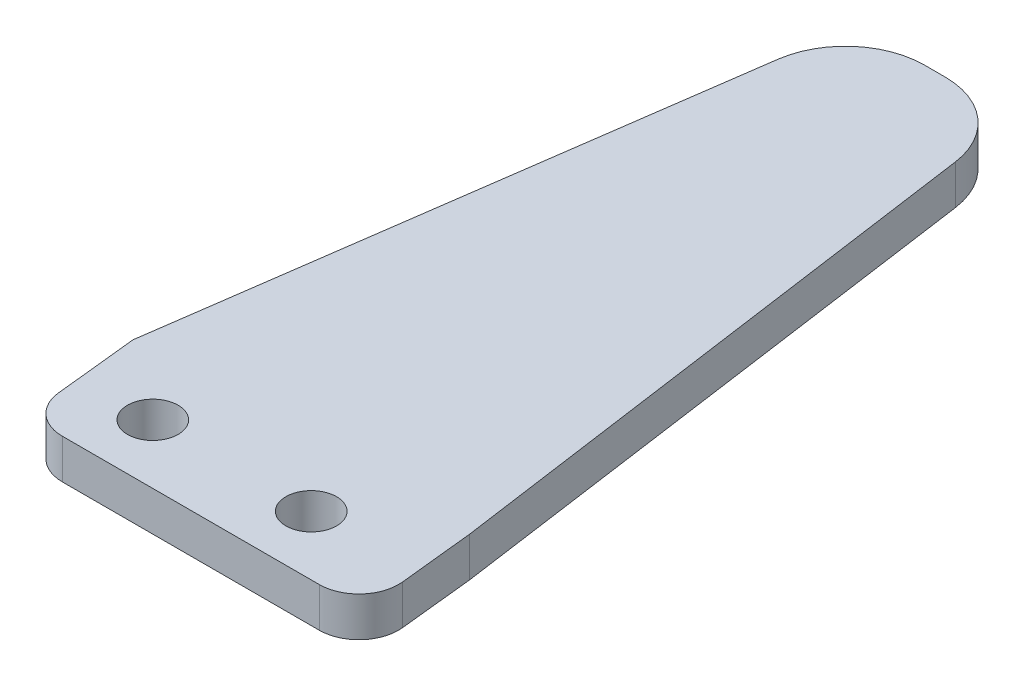
ISO-10303-21;
HEADER;
FILE_DESCRIPTION(('STEP AP214'),'2;1');
FILE_NAME('part.step','',(''),(''),'','','');
FILE_SCHEMA(('AUTOMOTIVE_DESIGN { 1 0 10303 214 1 1 1 1 }'));
ENDSEC;
DATA;
#1=APPLICATION_CONTEXT('core data for automotive mechanical design processes');
#2=APPLICATION_PROTOCOL_DEFINITION('international standard','automotive_design',2000,#1);
#3=PRODUCT_CONTEXT('',#1,'mechanical');
#4=PRODUCT('Part','Part','',(#3));
#5=PRODUCT_RELATED_PRODUCT_CATEGORY('part','',(#4));
#6=PRODUCT_DEFINITION_FORMATION('','',#4);
#7=PRODUCT_DEFINITION_CONTEXT('part definition',#1,'design');
#8=PRODUCT_DEFINITION('design','',#6,#7);
#9=PRODUCT_DEFINITION_SHAPE('','',#8);
#10=(LENGTH_UNIT() NAMED_UNIT(*) SI_UNIT(.MILLI.,.METRE.));
#11=(NAMED_UNIT(*) PLANE_ANGLE_UNIT() SI_UNIT($,.RADIAN.));
#12=(NAMED_UNIT(*) SI_UNIT($,.STERADIAN.) SOLID_ANGLE_UNIT());
#13=UNCERTAINTY_MEASURE_WITH_UNIT(LENGTH_MEASURE(1.E-05),#10,'distance_accuracy_value','');
#14=(GEOMETRIC_REPRESENTATION_CONTEXT(3) GLOBAL_UNCERTAINTY_ASSIGNED_CONTEXT((#13)) GLOBAL_UNIT_ASSIGNED_CONTEXT((#10,
#11,#12)) REPRESENTATION_CONTEXT('',''));
#15=CARTESIAN_POINT('',(0.,0.,0.));
#16=DIRECTION('',(0.,0.,1.));
#17=DIRECTION('',(1.,0.,0.));
#18=AXIS2_PLACEMENT_3D('',#15,#16,#17);
#19=CARTESIAN_POINT('',(0.,3.175,0.));
#20=DIRECTION('',(0.,1.,0.));
#21=DIRECTION('',(0.,0.,1.));
#22=AXIS2_PLACEMENT_3D('',#19,#20,#21);
#23=PLANE('',#22);
#24=CARTESIAN_POINT('',(50.8,3.175,-4.7625));
#25=DIRECTION('',(0.,1.,0.));
#26=DIRECTION('',(0.,0.,1.));
#27=AXIS2_PLACEMENT_3D('',#24,#25,#26);
#28=CIRCLE('',#27,2.03200000000001);
#29=CARTESIAN_POINT('',(50.8,3.175,-2.73049999999999));
#30=VERTEX_POINT('',#29);
#31=EDGE_CURVE('E269',#30,#30,#28,.T.);
#32=ORIENTED_EDGE('',*,*,#31,.F.);
#33=EDGE_LOOP('',(#32));
#34=FACE_BOUND('',#33,.T.);
#35=DIRECTION('',(1.,0.,0.));
#36=VECTOR('',#35,1.);
#37=CARTESIAN_POINT('',(45.4511178409056,3.175,0.));
#38=LINE('',#37,#36);
#39=CARTESIAN_POINT('',(48.3099006815512,3.175,0.));
#40=VERTEX_POINT('',#39);
#41=CARTESIAN_POINT('',(68.9124231063229,3.175,0.));
#42=VERTEX_POINT('',#41);
#43=EDGE_CURVE('E162',#40,#42,#38,.T.);
#44=ORIENTED_EDGE('',*,*,#43,.T.);
#45=CARTESIAN_POINT('',(68.9124231063229,3.175,-3.175));
#46=DIRECTION('',(0.,1.,0.));
#47=DIRECTION('',(0.,0.,1.));
#48=AXIS2_PLACEMENT_3D('',#45,#46,#47);
#49=CIRCLE('',#48,3.175);
#50=CARTESIAN_POINT('',(72.0700301241172,3.175,-3.50687787087481));
#51=VERTEX_POINT('',#50);
#52=EDGE_CURVE('E54',#42,#51,#49,.T.);
#53=ORIENTED_EDGE('',*,*,#52,.T.);
#54=DIRECTION('',(-0.104528463267657,0.,-0.994521895368273));
#55=VECTOR('',#54,1.);
#56=CARTESIAN_POINT('',(72.4386178409056,3.175,0.));
#57=LINE('',#56,#55);
#58=CARTESIAN_POINT('',(71.4375,3.175,-9.525));
#59=VERTEX_POINT('',#58);
#60=EDGE_CURVE('E226',#51,#59,#57,.T.);
#61=ORIENTED_EDGE('',*,*,#60,.T.);
#62=DIRECTION('',(-0.139254831399099,0.,-0.990256578838034));
#63=VECTOR('',#62,1.);
#64=CARTESIAN_POINT('',(71.4375,3.175,-9.525));
#65=LINE('',#64,#63);
#66=CARTESIAN_POINT('',(65.0623685372741,3.175,-54.8592681793843));
#67=VERTEX_POINT('',#66);
#68=EDGE_CURVE('E234',#59,#67,#65,.T.);
#69=ORIENTED_EDGE('',*,*,#68,.T.);
#70=CARTESIAN_POINT('',(58.7742392616526,3.175,-53.975));
#71=DIRECTION('',(0.,1.,0.));
#72=DIRECTION('',(0.,0.,1.));
#73=AXIS2_PLACEMENT_3D('',#70,#71,#72);
#74=CIRCLE('',#73,6.35);
#75=CARTESIAN_POINT('',(58.7742392616526,3.175,-60.325));
#76=VERTEX_POINT('',#75);
#77=EDGE_CURVE('E194',#67,#76,#74,.T.);
#78=ORIENTED_EDGE('',*,*,#77,.T.);
#79=DIRECTION('',(-1.,0.,0.));
#80=VECTOR('',#79,1.);
#81=CARTESIAN_POINT('',(64.29375,3.175,-60.325));
#82=LINE('',#81,#80);
#83=CARTESIAN_POINT('',(57.1132607383474,3.175,-60.325));
#84=VERTEX_POINT('',#83);
#85=EDGE_CURVE('E178',#76,#84,#82,.T.);
#86=ORIENTED_EDGE('',*,*,#85,.T.);
#87=CARTESIAN_POINT('',(57.1132607383474,3.175,-53.975));
#88=DIRECTION('',(0.,1.,0.));
#89=DIRECTION('',(0.,0.,1.));
#90=AXIS2_PLACEMENT_3D('',#87,#88,#89);
#91=CIRCLE('',#90,6.35);
#92=CARTESIAN_POINT('',(50.8251314627259,3.175,-54.8592681793843));
#93=VERTEX_POINT('',#92);
#94=EDGE_CURVE('E150',#84,#93,#91,.T.);
#95=ORIENTED_EDGE('',*,*,#94,.T.);
#96=DIRECTION('',(-0.139254831399099,0.,0.990256578838035));
#97=VECTOR('',#96,1.);
#98=CARTESIAN_POINT('',(44.45,3.175,-9.525));
#99=LINE('',#98,#97);
#100=CARTESIAN_POINT('',(44.45,3.175,-9.525));
#101=VERTEX_POINT('',#100);
#102=EDGE_CURVE('E144',#93,#101,#99,.T.);
#103=ORIENTED_EDGE('',*,*,#102,.T.);
#104=DIRECTION('',(0.104528463267659,0.,0.994521895368273));
#105=VECTOR('',#104,1.);
#106=CARTESIAN_POINT('',(44.45,3.175,-9.525));
#107=LINE('',#106,#105);
#108=CARTESIAN_POINT('',(45.152293663757,3.175,-2.84312212912518));
#109=VERTEX_POINT('',#108);
#110=EDGE_CURVE('E146',#101,#109,#107,.T.);
#111=ORIENTED_EDGE('',*,*,#110,.T.);
#112=CARTESIAN_POINT('',(48.3099006815512,3.175,-3.175));
#113=DIRECTION('',(0.,1.,0.));
#114=DIRECTION('',(0.,0.,1.));
#115=AXIS2_PLACEMENT_3D('',#112,#113,#114);
#116=CIRCLE('',#115,3.175);
#117=EDGE_CURVE('E218',#109,#40,#116,.T.);
#118=ORIENTED_EDGE('',*,*,#117,.T.);
#119=EDGE_LOOP('',(#44,#53,#61,#69,#78,#86,#95,#103,#111,#118));
#120=FACE_BOUND('',#119,.T.);
#121=CARTESIAN_POINT('',(63.5,3.175,-4.7625));
#122=DIRECTION('',(0.,1.,0.));
#123=DIRECTION('',(0.,0.,1.));
#124=AXIS2_PLACEMENT_3D('',#121,#122,#123);
#125=CIRCLE('',#124,2.03200000000001);
#126=CARTESIAN_POINT('',(63.5,3.175,-2.73049999999999));
#127=VERTEX_POINT('',#126);
#128=EDGE_CURVE('E283',#127,#127,#125,.T.);
#129=ORIENTED_EDGE('',*,*,#128,.F.);
#130=EDGE_LOOP('',(#129));
#131=FACE_BOUND('',#130,.T.);
#132=ADVANCED_FACE('F45',(#34,#120,#131),#23,.T.);
#133=CARTESIAN_POINT('',(0.,0.,0.));
#134=DIRECTION('',(0.,1.,0.));
#135=DIRECTION('',(0.,0.,1.));
#136=AXIS2_PLACEMENT_3D('',#133,#134,#135);
#137=PLANE('',#136);
#138=DIRECTION('',(-0.104528463267657,0.,-0.994521895368273));
#139=VECTOR('',#138,1.);
#140=CARTESIAN_POINT('',(72.4386178409056,0.,0.));
#141=LINE('',#140,#139);
#142=CARTESIAN_POINT('',(72.0700301241172,0.,-3.50687787087481));
#143=VERTEX_POINT('',#142);
#144=CARTESIAN_POINT('',(71.4375,0.,-9.525));
#145=VERTEX_POINT('',#144);
#146=EDGE_CURVE('E243',#143,#145,#141,.T.);
#147=ORIENTED_EDGE('',*,*,#146,.F.);
#148=CARTESIAN_POINT('',(68.9124231063229,0.,-3.175));
#149=DIRECTION('',(0.,1.,0.));
#150=DIRECTION('',(0.,0.,1.));
#151=AXIS2_PLACEMENT_3D('',#148,#149,#150);
#152=CIRCLE('',#151,3.175);
#153=CARTESIAN_POINT('',(68.9124231063229,0.,0.));
#154=VERTEX_POINT('',#153);
#155=EDGE_CURVE('E209',#143,#154,#152,.F.);
#156=ORIENTED_EDGE('',*,*,#155,.T.);
#157=DIRECTION('',(1.,0.,0.));
#158=VECTOR('',#157,1.);
#159=CARTESIAN_POINT('',(45.4511178409056,0.,0.));
#160=LINE('',#159,#158);
#161=CARTESIAN_POINT('',(48.3099006815512,0.,0.));
#162=VERTEX_POINT('',#161);
#163=EDGE_CURVE('E241',#162,#154,#160,.T.);
#164=ORIENTED_EDGE('',*,*,#163,.F.);
#165=CARTESIAN_POINT('',(48.3099006815512,0.,-3.175));
#166=DIRECTION('',(0.,1.,0.));
#167=DIRECTION('',(0.,0.,1.));
#168=AXIS2_PLACEMENT_3D('',#165,#166,#167);
#169=CIRCLE('',#168,3.175);
#170=CARTESIAN_POINT('',(45.152293663757,0.,-2.84312212912518));
#171=VERTEX_POINT('',#170);
#172=EDGE_CURVE('E206',#162,#171,#169,.F.);
#173=ORIENTED_EDGE('',*,*,#172,.T.);
#174=DIRECTION('',(0.104528463267659,0.,0.994521895368273));
#175=VECTOR('',#174,1.);
#176=CARTESIAN_POINT('',(44.45,0.,-9.525));
#177=LINE('',#176,#175);
#178=CARTESIAN_POINT('',(44.45,0.,-9.525));
#179=VERTEX_POINT('',#178);
#180=EDGE_CURVE('E246',#179,#171,#177,.T.);
#181=ORIENTED_EDGE('',*,*,#180,.F.);
#182=DIRECTION('',(-0.139254831399099,0.,0.990256578838035));
#183=VECTOR('',#182,1.);
#184=CARTESIAN_POINT('',(44.45,0.,-9.525));
#185=LINE('',#184,#183);
#186=CARTESIAN_POINT('',(50.8251314627259,0.,-54.8592681793843));
#187=VERTEX_POINT('',#186);
#188=EDGE_CURVE('E166',#187,#179,#185,.T.);
#189=ORIENTED_EDGE('',*,*,#188,.F.);
#190=CARTESIAN_POINT('',(57.1132607383474,0.,-53.975));
#191=DIRECTION('',(0.,1.,0.));
#192=DIRECTION('',(0.,0.,1.));
#193=AXIS2_PLACEMENT_3D('',#190,#191,#192);
#194=CIRCLE('',#193,6.35);
#195=CARTESIAN_POINT('',(57.1132607383474,0.,-60.325));
#196=VERTEX_POINT('',#195);
#197=EDGE_CURVE('E184',#187,#196,#194,.F.);
#198=ORIENTED_EDGE('',*,*,#197,.T.);
#199=DIRECTION('',(-1.,0.,0.));
#200=VECTOR('',#199,1.);
#201=CARTESIAN_POINT('',(64.29375,0.,-60.325));
#202=LINE('',#201,#200);
#203=CARTESIAN_POINT('',(58.7742392616526,0.,-60.325));
#204=VERTEX_POINT('',#203);
#205=EDGE_CURVE('E156',#204,#196,#202,.T.);
#206=ORIENTED_EDGE('',*,*,#205,.F.);
#207=CARTESIAN_POINT('',(58.7742392616526,0.,-53.975));
#208=DIRECTION('',(0.,1.,0.));
#209=DIRECTION('',(0.,0.,1.));
#210=AXIS2_PLACEMENT_3D('',#207,#208,#209);
#211=CIRCLE('',#210,6.35);
#212=CARTESIAN_POINT('',(65.0623685372741,0.,-54.8592681793843));
#213=VERTEX_POINT('',#212);
#214=EDGE_CURVE('E174',#204,#213,#211,.F.);
#215=ORIENTED_EDGE('',*,*,#214,.T.);
#216=DIRECTION('',(-0.139254831399099,0.,-0.990256578838034));
#217=VECTOR('',#216,1.);
#218=CARTESIAN_POINT('',(71.4375,0.,-9.525));
#219=LINE('',#218,#217);
#220=EDGE_CURVE('E250',#145,#213,#219,.T.);
#221=ORIENTED_EDGE('',*,*,#220,.F.);
#222=EDGE_LOOP('',(#147,#156,#164,#173,#181,#189,#198,#206,#215,#221));
#223=FACE_BOUND('',#222,.T.);
#224=CARTESIAN_POINT('',(50.8,0.,-4.7625));
#225=DIRECTION('',(0.,1.,0.));
#226=DIRECTION('',(0.,0.,1.));
#227=AXIS2_PLACEMENT_3D('',#224,#225,#226);
#228=CIRCLE('',#227,2.03200000000001);
#229=CARTESIAN_POINT('',(50.8,0.,-2.73049999999999));
#230=VERTEX_POINT('',#229);
#231=EDGE_CURVE('E272',#230,#230,#228,.T.);
#232=ORIENTED_EDGE('',*,*,#231,.T.);
#233=EDGE_LOOP('',(#232));
#234=FACE_BOUND('',#233,.T.);
#235=CARTESIAN_POINT('',(63.5,0.,-4.7625));
#236=DIRECTION('',(0.,1.,0.));
#237=DIRECTION('',(0.,0.,1.));
#238=AXIS2_PLACEMENT_3D('',#235,#236,#237);
#239=CIRCLE('',#238,2.03200000000001);
#240=CARTESIAN_POINT('',(63.5,0.,-2.73049999999999));
#241=VERTEX_POINT('',#240);
#242=EDGE_CURVE('E285',#241,#241,#239,.T.);
#243=ORIENTED_EDGE('',*,*,#242,.T.);
#244=EDGE_LOOP('',(#243));
#245=FACE_BOUND('',#244,.T.);
#246=ADVANCED_FACE('F239',(#223,#234,#245),#137,.F.);
#247=CARTESIAN_POINT('',(44.45,3.175,-9.525));
#248=DIRECTION('',(0.990256578838035,0.,0.139254831399099));
#249=DIRECTION('',(0.139254831399099,0.,-0.990256578838035));
#250=AXIS2_PLACEMENT_3D('',#247,#248,#249);
#251=PLANE('',#250);
#252=ORIENTED_EDGE('',*,*,#102,.F.);
#253=DIRECTION('',(0.,-1.,0.));
#254=VECTOR('',#253,1.);
#255=CARTESIAN_POINT('',(50.8251314627259,3.175,-54.8592681793843));
#256=LINE('',#255,#254);
#257=EDGE_CURVE('E169',#93,#187,#256,.T.);
#258=ORIENTED_EDGE('',*,*,#257,.T.);
#259=ORIENTED_EDGE('',*,*,#188,.T.);
#260=DIRECTION('',(0.,-1.,0.));
#261=VECTOR('',#260,1.);
#262=CARTESIAN_POINT('',(44.45,3.175,-9.525));
#263=LINE('',#262,#261);
#264=EDGE_CURVE('E160',#101,#179,#263,.T.);
#265=ORIENTED_EDGE('',*,*,#264,.F.);
#266=EDGE_LOOP('',(#252,#258,#259,#265));
#267=FACE_BOUND('',#266,.T.);
#268=ADVANCED_FACE('F164',(#267),#251,.F.);
#269=CARTESIAN_POINT('',(44.45,3.175,-9.525));
#270=DIRECTION('',(0.994521895368273,0.,-0.104528463267659));
#271=DIRECTION('',(-0.104528463267659,0.,-0.994521895368273));
#272=AXIS2_PLACEMENT_3D('',#269,#270,#271);
#273=PLANE('',#272);
#274=ORIENTED_EDGE('',*,*,#180,.T.);
#275=DIRECTION('',(0.,-1.,0.));
#276=VECTOR('',#275,1.);
#277=CARTESIAN_POINT('',(45.152293663757,3.175,-2.84312212912518));
#278=LINE('',#277,#276);
#279=EDGE_CURVE('E11',#171,#109,#278,.F.);
#280=ORIENTED_EDGE('',*,*,#279,.T.);
#281=ORIENTED_EDGE('',*,*,#110,.F.);
#282=ORIENTED_EDGE('',*,*,#264,.T.);
#283=EDGE_LOOP('',(#274,#280,#281,#282));
#284=FACE_BOUND('',#283,.T.);
#285=ADVANCED_FACE('F159',(#284),#273,.F.);
#286=CARTESIAN_POINT('',(45.4511178409056,3.175,0.));
#287=DIRECTION('',(0.,0.,-1.));
#288=DIRECTION('',(-1.,0.,0.));
#289=AXIS2_PLACEMENT_3D('',#286,#287,#288);
#290=PLANE('',#289);
#291=ORIENTED_EDGE('',*,*,#163,.T.);
#292=DIRECTION('',(0.,-1.,0.));
#293=VECTOR('',#292,1.);
#294=CARTESIAN_POINT('',(68.9124231063229,3.175,0.));
#295=LINE('',#294,#293);
#296=EDGE_CURVE('E72',#154,#42,#295,.F.);
#297=ORIENTED_EDGE('',*,*,#296,.T.);
#298=ORIENTED_EDGE('',*,*,#43,.F.);
#299=DIRECTION('',(0.,-1.,0.));
#300=VECTOR('',#299,1.);
#301=CARTESIAN_POINT('',(48.3099006815512,3.175,0.));
#302=LINE('',#301,#300);
#303=EDGE_CURVE('E212',#40,#162,#302,.T.);
#304=ORIENTED_EDGE('',*,*,#303,.T.);
#305=EDGE_LOOP('',(#291,#297,#298,#304));
#306=FACE_BOUND('',#305,.T.);
#307=ADVANCED_FACE('F244',(#306),#290,.F.);
#308=CARTESIAN_POINT('',(72.4386178409056,3.175,0.));
#309=DIRECTION('',(-0.994521895368273,0.,0.104528463267657));
#310=DIRECTION('',(0.104528463267657,0.,0.994521895368273));
#311=AXIS2_PLACEMENT_3D('',#308,#309,#310);
#312=PLANE('',#311);
#313=ORIENTED_EDGE('',*,*,#60,.F.);
#314=DIRECTION('',(0.,-1.,0.));
#315=VECTOR('',#314,1.);
#316=CARTESIAN_POINT('',(72.0700301241172,3.175,-3.50687787087481));
#317=LINE('',#316,#315);
#318=EDGE_CURVE('E202',#51,#143,#317,.T.);
#319=ORIENTED_EDGE('',*,*,#318,.T.);
#320=ORIENTED_EDGE('',*,*,#146,.T.);
#321=DIRECTION('',(0.,-1.,0.));
#322=VECTOR('',#321,1.);
#323=CARTESIAN_POINT('',(71.4375,3.175,-9.525));
#324=LINE('',#323,#322);
#325=EDGE_CURVE('E170',#59,#145,#324,.T.);
#326=ORIENTED_EDGE('',*,*,#325,.F.);
#327=EDGE_LOOP('',(#313,#319,#320,#326));
#328=FACE_BOUND('',#327,.T.);
#329=ADVANCED_FACE('F231',(#328),#312,.F.);
#330=CARTESIAN_POINT('',(71.4375,3.175,-9.525));
#331=DIRECTION('',(-0.990256578838034,0.,0.139254831399099));
#332=DIRECTION('',(0.139254831399099,0.,0.990256578838035));
#333=AXIS2_PLACEMENT_3D('',#330,#331,#332);
#334=PLANE('',#333);
#335=ORIENTED_EDGE('',*,*,#220,.T.);
#336=DIRECTION('',(0.,-1.,0.));
#337=VECTOR('',#336,1.);
#338=CARTESIAN_POINT('',(65.0623685372741,3.175,-54.8592681793843));
#339=LINE('',#338,#337);
#340=EDGE_CURVE('E199',#213,#67,#339,.F.);
#341=ORIENTED_EDGE('',*,*,#340,.T.);
#342=ORIENTED_EDGE('',*,*,#68,.F.);
#343=ORIENTED_EDGE('',*,*,#325,.T.);
#344=EDGE_LOOP('',(#335,#341,#342,#343));
#345=FACE_BOUND('',#344,.T.);
#346=ADVANCED_FACE('F306',(#345),#334,.F.);
#347=CARTESIAN_POINT('',(64.29375,3.175,-60.325));
#348=DIRECTION('',(0.,0.,1.));
#349=DIRECTION('',(1.,0.,0.));
#350=AXIS2_PLACEMENT_3D('',#347,#348,#349);
#351=PLANE('',#350);
#352=ORIENTED_EDGE('',*,*,#205,.T.);
#353=DIRECTION('',(0.,-1.,0.));
#354=VECTOR('',#353,1.);
#355=CARTESIAN_POINT('',(57.1132607383474,3.175,-60.325));
#356=LINE('',#355,#354);
#357=EDGE_CURVE('E191',#196,#84,#356,.F.);
#358=ORIENTED_EDGE('',*,*,#357,.T.);
#359=ORIENTED_EDGE('',*,*,#85,.F.);
#360=DIRECTION('',(0.,-1.,0.));
#361=VECTOR('',#360,1.);
#362=CARTESIAN_POINT('',(58.7742392616526,3.175,-60.325));
#363=LINE('',#362,#361);
#364=EDGE_CURVE('E187',#76,#204,#363,.T.);
#365=ORIENTED_EDGE('',*,*,#364,.T.);
#366=EDGE_LOOP('',(#352,#358,#359,#365));
#367=FACE_BOUND('',#366,.T.);
#368=ADVANCED_FACE('F263',(#367),#351,.F.);
#369=CARTESIAN_POINT('',(50.8,3.175,-4.7625));
#370=DIRECTION('',(0.,-1.,0.));
#371=DIRECTION('',(0.,0.,-1.));
#372=AXIS2_PLACEMENT_3D('',#369,#370,#371);
#373=CYLINDRICAL_SURFACE('',#372,2.03200000000001);
#374=ORIENTED_EDGE('',*,*,#31,.T.);
#375=EDGE_LOOP('',(#374));
#376=FACE_BOUND('',#375,.T.);
#377=ORIENTED_EDGE('',*,*,#231,.F.);
#378=EDGE_LOOP('',(#377));
#379=FACE_BOUND('',#378,.T.);
#380=ADVANCED_FACE('F301',(#376,#379),#373,.F.);
#381=CARTESIAN_POINT('',(63.5,3.175,-4.7625));
#382=DIRECTION('',(0.,-1.,0.));
#383=DIRECTION('',(0.,0.,-1.));
#384=AXIS2_PLACEMENT_3D('',#381,#382,#383);
#385=CYLINDRICAL_SURFACE('',#384,2.03200000000001);
#386=ORIENTED_EDGE('',*,*,#128,.T.);
#387=EDGE_LOOP('',(#386));
#388=FACE_BOUND('',#387,.T.);
#389=ORIENTED_EDGE('',*,*,#242,.F.);
#390=EDGE_LOOP('',(#389));
#391=FACE_BOUND('',#390,.T.);
#392=ADVANCED_FACE('F291',(#388,#391),#385,.F.);
#393=CARTESIAN_POINT('',(57.1132607383474,3.175,-53.975));
#394=DIRECTION('',(0.,-1.,0.));
#395=DIRECTION('',(0.,0.,-1.));
#396=AXIS2_PLACEMENT_3D('',#393,#394,#395);
#397=CYLINDRICAL_SURFACE('',#396,6.35);
#398=ORIENTED_EDGE('',*,*,#94,.F.);
#399=ORIENTED_EDGE('',*,*,#357,.F.);
#400=ORIENTED_EDGE('',*,*,#197,.F.);
#401=ORIENTED_EDGE('',*,*,#257,.F.);
#402=EDGE_LOOP('',(#398,#399,#400,#401));
#403=FACE_BOUND('',#402,.T.);
#404=ADVANCED_FACE('F267',(#403),#397,.T.);
#405=CARTESIAN_POINT('',(58.7742392616526,3.175,-53.975));
#406=DIRECTION('',(0.,-1.,0.));
#407=DIRECTION('',(0.,0.,-1.));
#408=AXIS2_PLACEMENT_3D('',#405,#406,#407);
#409=CYLINDRICAL_SURFACE('',#408,6.35);
#410=ORIENTED_EDGE('',*,*,#77,.F.);
#411=ORIENTED_EDGE('',*,*,#340,.F.);
#412=ORIENTED_EDGE('',*,*,#214,.F.);
#413=ORIENTED_EDGE('',*,*,#364,.F.);
#414=EDGE_LOOP('',(#410,#411,#412,#413));
#415=FACE_BOUND('',#414,.T.);
#416=ADVANCED_FACE('F320',(#415),#409,.T.);
#417=CARTESIAN_POINT('',(68.9124231063229,3.175,-3.175));
#418=DIRECTION('',(0.,-1.,0.));
#419=DIRECTION('',(0.,0.,-1.));
#420=AXIS2_PLACEMENT_3D('',#417,#418,#419);
#421=CYLINDRICAL_SURFACE('',#420,3.175);
#422=ORIENTED_EDGE('',*,*,#52,.F.);
#423=ORIENTED_EDGE('',*,*,#296,.F.);
#424=ORIENTED_EDGE('',*,*,#155,.F.);
#425=ORIENTED_EDGE('',*,*,#318,.F.);
#426=EDGE_LOOP('',(#422,#423,#424,#425));
#427=FACE_BOUND('',#426,.T.);
#428=ADVANCED_FACE('F236',(#427),#421,.T.);
#429=CARTESIAN_POINT('',(48.3099006815512,3.175,-3.175));
#430=DIRECTION('',(0.,-1.,0.));
#431=DIRECTION('',(0.,0.,-1.));
#432=AXIS2_PLACEMENT_3D('',#429,#430,#431);
#433=CYLINDRICAL_SURFACE('',#432,3.175);
#434=ORIENTED_EDGE('',*,*,#117,.F.);
#435=ORIENTED_EDGE('',*,*,#279,.F.);
#436=ORIENTED_EDGE('',*,*,#172,.F.);
#437=ORIENTED_EDGE('',*,*,#303,.F.);
#438=EDGE_LOOP('',(#434,#435,#436,#437));
#439=FACE_BOUND('',#438,.T.);
#440=ADVANCED_FACE('F47',(#439),#433,.T.);
#441=CLOSED_SHELL('',(#132,#246,#268,#285,#307,#329,#346,#368,#380,#392,#404,#416,#428,#440));
#442=MANIFOLD_SOLID_BREP('B2',#441);
#443=ADVANCED_BREP_SHAPE_REPRESENTATION('',(#18,#442),#14);
#444=SHAPE_DEFINITION_REPRESENTATION(#9,#443);
ENDSEC;
END-ISO-10303-21;
